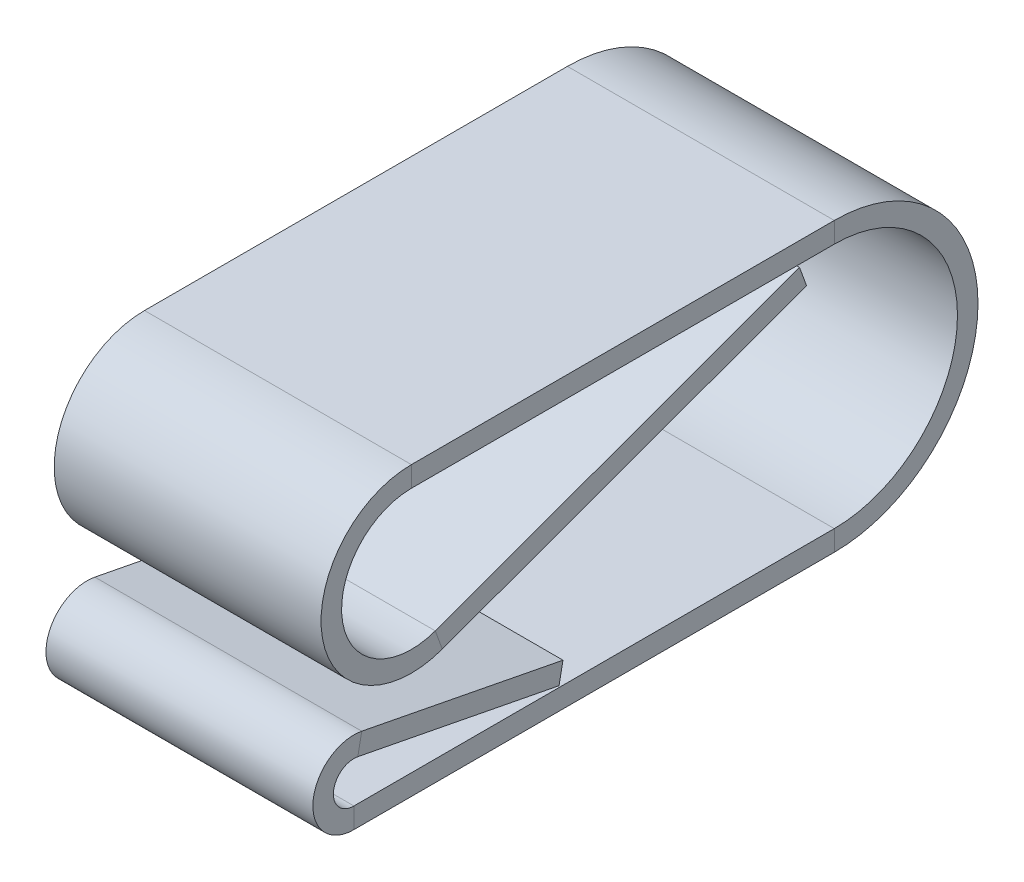
ISO-10303-21;
HEADER;
FILE_DESCRIPTION(('STEP AP214'),'2;1');
FILE_NAME('part.step','',(''),(''),'','','');
FILE_SCHEMA(('AUTOMOTIVE_DESIGN { 1 0 10303 214 1 1 1 1 }'));
ENDSEC;
DATA;
#1=APPLICATION_CONTEXT('core data for automotive mechanical design processes');
#2=APPLICATION_PROTOCOL_DEFINITION('international standard','automotive_design',2000,#1);
#3=PRODUCT_CONTEXT('',#1,'mechanical');
#4=PRODUCT('Part','Part','',(#3));
#5=PRODUCT_RELATED_PRODUCT_CATEGORY('part','',(#4));
#6=PRODUCT_DEFINITION_FORMATION('','',#4);
#7=PRODUCT_DEFINITION_CONTEXT('part definition',#1,'design');
#8=PRODUCT_DEFINITION('design','',#6,#7);
#9=PRODUCT_DEFINITION_SHAPE('','',#8);
#10=(LENGTH_UNIT() NAMED_UNIT(*) SI_UNIT(.MILLI.,.METRE.));
#11=(NAMED_UNIT(*) PLANE_ANGLE_UNIT() SI_UNIT($,.RADIAN.));
#12=(NAMED_UNIT(*) SI_UNIT($,.STERADIAN.) SOLID_ANGLE_UNIT());
#13=UNCERTAINTY_MEASURE_WITH_UNIT(LENGTH_MEASURE(1.E-05),#10,'distance_accuracy_value','');
#14=(GEOMETRIC_REPRESENTATION_CONTEXT(3) GLOBAL_UNCERTAINTY_ASSIGNED_CONTEXT((#13)) GLOBAL_UNIT_ASSIGNED_CONTEXT((#10,
#11,#12)) REPRESENTATION_CONTEXT('',''));
#15=CARTESIAN_POINT('',(0.,0.,0.));
#16=DIRECTION('',(0.,0.,1.));
#17=DIRECTION('',(1.,0.,0.));
#18=AXIS2_PLACEMENT_3D('',#15,#16,#17);
#19=CARTESIAN_POINT('',(0.,6.5,-6.45));
#20=DIRECTION('',(1.,0.,0.));
#21=DIRECTION('',(0.,0.,-1.));
#22=AXIS2_PLACEMENT_3D('',#19,#20,#21);
#23=PLANE('',#22);
#24=DIRECTION('',(0.,0.,1.));
#25=VECTOR('',#24,1.);
#26=CARTESIAN_POINT('',(0.,6.,-6.45));
#27=LINE('',#26,#25);
#28=CARTESIAN_POINT('',(0.,6.,-2.4));
#29=VERTEX_POINT('',#28);
#30=CARTESIAN_POINT('',(0.,6.,-12.7));
#31=VERTEX_POINT('',#30);
#32=EDGE_CURVE('E198',#29,#31,#27,.F.);
#33=ORIENTED_EDGE('',*,*,#32,.F.);
#34=DIRECTION('',(0.,1.,0.));
#35=VECTOR('',#34,1.);
#36=CARTESIAN_POINT('',(0.,6.,-2.4));
#37=LINE('',#36,#35);
#38=CARTESIAN_POINT('',(0.,6.5,-2.4));
#39=VERTEX_POINT('',#38);
#40=EDGE_CURVE('E173',#29,#39,#37,.T.);
#41=ORIENTED_EDGE('',*,*,#40,.T.);
#42=DIRECTION('',(0.,0.,-1.));
#43=VECTOR('',#42,1.);
#44=CARTESIAN_POINT('',(0.,6.5,-6.45));
#45=LINE('',#44,#43);
#46=CARTESIAN_POINT('',(0.,6.5,-12.7));
#47=VERTEX_POINT('',#46);
#48=EDGE_CURVE('E190',#39,#47,#45,.T.);
#49=ORIENTED_EDGE('',*,*,#48,.T.);
#50=DIRECTION('',(0.,1.,0.));
#51=VECTOR('',#50,1.);
#52=CARTESIAN_POINT('',(0.,6.5,-12.7));
#53=LINE('',#52,#51);
#54=EDGE_CURVE('E209',#31,#47,#53,.T.);
#55=ORIENTED_EDGE('',*,*,#54,.F.);
#56=EDGE_LOOP('',(#33,#41,#49,#55));
#57=FACE_BOUND('',#56,.T.);
#58=ADVANCED_FACE('F43',(#57),#23,.F.);
#59=CARTESIAN_POINT('',(0.,-0.5,0.));
#60=DIRECTION('',(-1.,0.,0.));
#61=DIRECTION('',(0.,0.,1.));
#62=AXIS2_PLACEMENT_3D('',#59,#60,#61);
#63=PLANE('',#62);
#64=DIRECTION('',(0.,0.,1.));
#65=VECTOR('',#64,1.);
#66=CARTESIAN_POINT('',(0.,0.,0.));
#67=LINE('',#66,#65);
#68=CARTESIAN_POINT('',(0.,0.,-12.7));
#69=VERTEX_POINT('',#68);
#70=CARTESIAN_POINT('',(0.,0.,-1.));
#71=VERTEX_POINT('',#70);
#72=EDGE_CURVE('E268',#69,#71,#67,.T.);
#73=ORIENTED_EDGE('',*,*,#72,.F.);
#74=DIRECTION('',(0.,-1.,0.));
#75=VECTOR('',#74,1.);
#76=CARTESIAN_POINT('',(0.,0.,-12.7));
#77=LINE('',#76,#75);
#78=CARTESIAN_POINT('',(0.,-0.5,-12.7));
#79=VERTEX_POINT('',#78);
#80=EDGE_CURVE('E287',#69,#79,#77,.T.);
#81=ORIENTED_EDGE('',*,*,#80,.T.);
#82=DIRECTION('',(0.,0.,1.));
#83=VECTOR('',#82,1.);
#84=CARTESIAN_POINT('',(0.,-0.5,0.));
#85=LINE('',#84,#83);
#86=CARTESIAN_POINT('',(0.,-0.499999999999992,-0.999999999999999));
#87=VERTEX_POINT('',#86);
#88=EDGE_CURVE('E52',#79,#87,#85,.T.);
#89=ORIENTED_EDGE('',*,*,#88,.T.);
#90=DIRECTION('',(0.,-1.,0.));
#91=VECTOR('',#90,1.);
#92=CARTESIAN_POINT('',(0.,0.,-1.));
#93=LINE('',#92,#91);
#94=EDGE_CURVE('E231',#71,#87,#93,.T.);
#95=ORIENTED_EDGE('',*,*,#94,.F.);
#96=EDGE_LOOP('',(#73,#81,#89,#95));
#97=FACE_BOUND('',#96,.T.);
#98=ADVANCED_FACE('F45',(#97),#63,.T.);
#99=CARTESIAN_POINT('',(6.5,-0.5,0.));
#100=DIRECTION('',(1.,0.,0.));
#101=DIRECTION('',(0.,0.,-1.));
#102=AXIS2_PLACEMENT_3D('',#99,#100,#101);
#103=PLANE('',#102);
#104=DIRECTION('',(0.,-1.,0.));
#105=VECTOR('',#104,1.);
#106=CARTESIAN_POINT('',(6.5,0.,-12.7));
#107=LINE('',#106,#105);
#108=CARTESIAN_POINT('',(6.5,0.,-12.7));
#109=VERTEX_POINT('',#108);
#110=CARTESIAN_POINT('',(6.5,-0.5,-12.7));
#111=VERTEX_POINT('',#110);
#112=EDGE_CURVE('E208',#109,#111,#107,.T.);
#113=ORIENTED_EDGE('',*,*,#112,.F.);
#114=DIRECTION('',(0.,0.,-1.));
#115=VECTOR('',#114,1.);
#116=CARTESIAN_POINT('',(6.5,0.,0.));
#117=LINE('',#116,#115);
#118=CARTESIAN_POINT('',(6.5,0.,-1.));
#119=VERTEX_POINT('',#118);
#120=EDGE_CURVE('E47',#119,#109,#117,.T.);
#121=ORIENTED_EDGE('',*,*,#120,.F.);
#122=DIRECTION('',(0.,-1.,0.));
#123=VECTOR('',#122,1.);
#124=CARTESIAN_POINT('',(6.5,0.,-1.));
#125=LINE('',#124,#123);
#126=CARTESIAN_POINT('',(6.5,-0.499999999999992,-0.999999999999999));
#127=VERTEX_POINT('',#126);
#128=EDGE_CURVE('E221',#119,#127,#125,.T.);
#129=ORIENTED_EDGE('',*,*,#128,.T.);
#130=DIRECTION('',(0.,0.,-1.));
#131=VECTOR('',#130,1.);
#132=CARTESIAN_POINT('',(6.5,-0.5,0.));
#133=LINE('',#132,#131);
#134=EDGE_CURVE('E11',#127,#111,#133,.T.);
#135=ORIENTED_EDGE('',*,*,#134,.T.);
#136=EDGE_LOOP('',(#113,#121,#129,#135));
#137=FACE_BOUND('',#136,.T.);
#138=ADVANCED_FACE('F280',(#137),#103,.T.);
#139=CARTESIAN_POINT('',(0.,-0.5,0.));
#140=DIRECTION('',(0.,-1.,0.));
#141=DIRECTION('',(0.,0.,-1.));
#142=AXIS2_PLACEMENT_3D('',#139,#140,#141);
#143=PLANE('',#142);
#144=DIRECTION('',(-1.,0.,0.));
#145=VECTOR('',#144,1.);
#146=CARTESIAN_POINT('',(0.,-0.5,-12.7));
#147=LINE('',#146,#145);
#148=EDGE_CURVE('E306',#79,#111,#147,.F.);
#149=ORIENTED_EDGE('',*,*,#148,.T.);
#150=ORIENTED_EDGE('',*,*,#134,.F.);
#151=DIRECTION('',(1.,0.,0.));
#152=VECTOR('',#151,1.);
#153=CARTESIAN_POINT('',(6.5,-0.499999999999992,-0.999999999999999));
#154=LINE('',#153,#152);
#155=EDGE_CURVE('E214',#127,#87,#154,.F.);
#156=ORIENTED_EDGE('',*,*,#155,.T.);
#157=ORIENTED_EDGE('',*,*,#88,.F.);
#158=EDGE_LOOP('',(#149,#150,#156,#157));
#159=FACE_BOUND('',#158,.T.);
#160=ADVANCED_FACE('F425',(#159),#143,.T.);
#161=CARTESIAN_POINT('',(0.,0.,0.));
#162=DIRECTION('',(0.,-1.,0.));
#163=DIRECTION('',(0.,0.,-1.));
#164=AXIS2_PLACEMENT_3D('',#161,#162,#163);
#165=PLANE('',#164);
#166=ORIENTED_EDGE('',*,*,#120,.T.);
#167=DIRECTION('',(-1.,0.,0.));
#168=VECTOR('',#167,1.);
#169=CARTESIAN_POINT('',(0.,0.,-12.7));
#170=LINE('',#169,#168);
#171=EDGE_CURVE('E277',#69,#109,#170,.F.);
#172=ORIENTED_EDGE('',*,*,#171,.F.);
#173=ORIENTED_EDGE('',*,*,#72,.T.);
#174=DIRECTION('',(1.,0.,0.));
#175=VECTOR('',#174,1.);
#176=CARTESIAN_POINT('',(6.5,0.,-1.));
#177=LINE('',#176,#175);
#178=EDGE_CURVE('E227',#119,#71,#177,.F.);
#179=ORIENTED_EDGE('',*,*,#178,.F.);
#180=EDGE_LOOP('',(#166,#172,#173,#179));
#181=FACE_BOUND('',#180,.T.);
#182=ADVANCED_FACE('F276',(#181),#165,.F.);
#183=CARTESIAN_POINT('',(6.5,1.00530128712337,-3.64129329822227));
#184=DIRECTION('',(-1.,0.,0.));
#185=DIRECTION('',(0.,0.190808995376552,0.981627183447662));
#186=AXIS2_PLACEMENT_3D('',#183,#184,#185);
#187=PLANE('',#186);
#188=DIRECTION('',(0.,0.981627183447662,-0.190808995376552));
#189=VECTOR('',#188,1.);
#190=CARTESIAN_POINT('',(6.5,1.48162718344766,-1.19080899537655));
#191=LINE('',#190,#189);
#192=CARTESIAN_POINT('',(6.5,0.990813591723831,-1.09540449768828));
#193=VERTEX_POINT('',#192);
#194=CARTESIAN_POINT('',(6.5,1.48162718344766,-1.19080899537655));
#195=VERTEX_POINT('',#194);
#196=EDGE_CURVE('E262',#193,#195,#191,.T.);
#197=ORIENTED_EDGE('',*,*,#196,.F.);
#198=DIRECTION('',(0.,0.190808995376552,0.981627183447663));
#199=VECTOR('',#198,1.);
#200=CARTESIAN_POINT('',(6.5,0.514487695399534,-3.545888800534));
#201=LINE('',#200,#199);
#202=CARTESIAN_POINT('',(6.5,0.0381617990752364,-5.99637310337972));
#203=VERTEX_POINT('',#202);
#204=EDGE_CURVE('E253',#203,#193,#201,.T.);
#205=ORIENTED_EDGE('',*,*,#204,.F.);
#206=DIRECTION('',(0.,0.981627183447662,-0.190808995376552));
#207=VECTOR('',#206,1.);
#208=CARTESIAN_POINT('',(6.5,0.528975390799068,-6.09177760106799));
#209=LINE('',#208,#207);
#210=CARTESIAN_POINT('',(6.5,0.528975390799068,-6.09177760106799));
#211=VERTEX_POINT('',#210);
#212=EDGE_CURVE('E260',#203,#211,#209,.T.);
#213=ORIENTED_EDGE('',*,*,#212,.T.);
#214=DIRECTION('',(0.,0.190808995376552,0.981627183447662));
#215=VECTOR('',#214,1.);
#216=CARTESIAN_POINT('',(6.5,1.00530128712337,-3.64129329822227));
#217=LINE('',#216,#215);
#218=EDGE_CURVE('E241',#211,#195,#217,.T.);
#219=ORIENTED_EDGE('',*,*,#218,.T.);
#220=EDGE_LOOP('',(#197,#205,#213,#219));
#221=FACE_BOUND('',#220,.T.);
#222=ADVANCED_FACE('F417',(#221),#187,.F.);
#223=CARTESIAN_POINT('',(3.25,0.528975390799068,-6.09177760106799));
#224=DIRECTION('',(0.,0.190808995376552,0.981627183447663));
#225=DIRECTION('',(1.,0.,0.));
#226=AXIS2_PLACEMENT_3D('',#223,#224,#225);
#227=PLANE('',#226);
#228=ORIENTED_EDGE('',*,*,#212,.F.);
#229=DIRECTION('',(1.,0.,0.));
#230=VECTOR('',#229,1.);
#231=CARTESIAN_POINT('',(3.25,0.0381617990752364,-5.99637310337972));
#232=LINE('',#231,#230);
#233=CARTESIAN_POINT('',(0.,0.0381617990752364,-5.99637310337972));
#234=VERTEX_POINT('',#233);
#235=EDGE_CURVE('E250',#234,#203,#232,.T.);
#236=ORIENTED_EDGE('',*,*,#235,.F.);
#237=DIRECTION('',(0.,0.981627183447662,-0.190808995376552));
#238=VECTOR('',#237,1.);
#239=CARTESIAN_POINT('',(0.,0.528975390799068,-6.09177760106799));
#240=LINE('',#239,#238);
#241=CARTESIAN_POINT('',(0.,0.528975390799068,-6.09177760106799));
#242=VERTEX_POINT('',#241);
#243=EDGE_CURVE('E240',#234,#242,#240,.T.);
#244=ORIENTED_EDGE('',*,*,#243,.T.);
#245=DIRECTION('',(1.,0.,0.));
#246=VECTOR('',#245,1.);
#247=CARTESIAN_POINT('',(3.25,0.528975390799068,-6.09177760106799));
#248=LINE('',#247,#246);
#249=EDGE_CURVE('E237',#242,#211,#248,.T.);
#250=ORIENTED_EDGE('',*,*,#249,.T.);
#251=EDGE_LOOP('',(#228,#236,#244,#250));
#252=FACE_BOUND('',#251,.T.);
#253=ADVANCED_FACE('F414',(#252),#227,.F.);
#254=CARTESIAN_POINT('',(0.,1.00530128712337,-3.64129329822227));
#255=DIRECTION('',(1.,0.,0.));
#256=DIRECTION('',(0.,-0.190808995376552,-0.981627183447662));
#257=AXIS2_PLACEMENT_3D('',#254,#255,#256);
#258=PLANE('',#257);
#259=DIRECTION('',(0.,0.190808995376552,0.981627183447663));
#260=VECTOR('',#259,1.);
#261=CARTESIAN_POINT('',(0.,0.514487695399534,-3.545888800534));
#262=LINE('',#261,#260);
#263=CARTESIAN_POINT('',(0.,0.990813591723831,-1.09540449768828));
#264=VERTEX_POINT('',#263);
#265=EDGE_CURVE('E234',#264,#234,#262,.F.);
#266=ORIENTED_EDGE('',*,*,#265,.F.);
#267=DIRECTION('',(0.,0.981627183447662,-0.190808995376552));
#268=VECTOR('',#267,1.);
#269=CARTESIAN_POINT('',(0.,1.48162718344766,-1.19080899537655));
#270=LINE('',#269,#268);
#271=CARTESIAN_POINT('',(0.,1.48162718344766,-1.19080899537655));
#272=VERTEX_POINT('',#271);
#273=EDGE_CURVE('E265',#264,#272,#270,.T.);
#274=ORIENTED_EDGE('',*,*,#273,.T.);
#275=DIRECTION('',(0.,-0.190808995376552,-0.981627183447662));
#276=VECTOR('',#275,1.);
#277=CARTESIAN_POINT('',(0.,1.00530128712337,-3.64129329822227));
#278=LINE('',#277,#276);
#279=EDGE_CURVE('E247',#272,#242,#278,.T.);
#280=ORIENTED_EDGE('',*,*,#279,.T.);
#281=ORIENTED_EDGE('',*,*,#243,.F.);
#282=EDGE_LOOP('',(#266,#274,#280,#281));
#283=FACE_BOUND('',#282,.T.);
#284=ADVANCED_FACE('F409',(#283),#258,.F.);
#285=CARTESIAN_POINT('',(3.25,1.00530128712337,-3.64129329822227));
#286=DIRECTION('',(0.,0.981627183447662,-0.190808995376552));
#287=DIRECTION('',(0.,0.190808995376552,0.981627183447663));
#288=AXIS2_PLACEMENT_3D('',#285,#286,#287);
#289=PLANE('',#288);
#290=ORIENTED_EDGE('',*,*,#249,.F.);
#291=ORIENTED_EDGE('',*,*,#279,.F.);
#292=DIRECTION('',(-1.,0.,0.));
#293=VECTOR('',#292,1.);
#294=CARTESIAN_POINT('',(3.25,1.48162718344766,-1.19080899537655));
#295=LINE('',#294,#293);
#296=EDGE_CURVE('E244',#195,#272,#295,.T.);
#297=ORIENTED_EDGE('',*,*,#296,.F.);
#298=ORIENTED_EDGE('',*,*,#218,.F.);
#299=EDGE_LOOP('',(#290,#291,#297,#298));
#300=FACE_BOUND('',#299,.T.);
#301=ADVANCED_FACE('F406',(#300),#289,.T.);
#302=CARTESIAN_POINT('',(3.25,0.514487695399534,-3.545888800534));
#303=DIRECTION('',(0.,0.981627183447662,-0.190808995376552));
#304=DIRECTION('',(0.,0.190808995376552,0.981627183447663));
#305=AXIS2_PLACEMENT_3D('',#302,#303,#304);
#306=PLANE('',#305);
#307=ORIENTED_EDGE('',*,*,#235,.T.);
#308=ORIENTED_EDGE('',*,*,#204,.T.);
#309=DIRECTION('',(1.,0.,0.));
#310=VECTOR('',#309,1.);
#311=CARTESIAN_POINT('',(3.25,0.990813591723831,-1.09540449768828));
#312=LINE('',#311,#310);
#313=EDGE_CURVE('E256',#193,#264,#312,.F.);
#314=ORIENTED_EDGE('',*,*,#313,.T.);
#315=ORIENTED_EDGE('',*,*,#265,.T.);
#316=EDGE_LOOP('',(#307,#308,#314,#315));
#317=FACE_BOUND('',#316,.T.);
#318=ADVANCED_FACE('F401',(#317),#306,.F.);
#319=CARTESIAN_POINT('',(0.,0.500000000000004,-1.));
#320=DIRECTION('',(-1.,0.,0.));
#321=DIRECTION('',(0.,0.,1.));
#322=AXIS2_PLACEMENT_3D('',#319,#320,#321);
#323=PLANE('',#322);
#324=ORIENTED_EDGE('',*,*,#273,.F.);
#325=CARTESIAN_POINT('',(0.,0.500000000000004,-1.));
#326=DIRECTION('',(1.,0.,0.));
#327=DIRECTION('',(0.,0.,-1.));
#328=AXIS2_PLACEMENT_3D('',#325,#326,#327);
#329=CIRCLE('',#328,0.499999999999996);
#330=EDGE_CURVE('E224',#71,#264,#329,.F.);
#331=ORIENTED_EDGE('',*,*,#330,.F.);
#332=ORIENTED_EDGE('',*,*,#94,.T.);
#333=CARTESIAN_POINT('',(0.,0.500000000000004,-1.));
#334=DIRECTION('',(1.,0.,0.));
#335=DIRECTION('',(0.,0.,-1.));
#336=AXIS2_PLACEMENT_3D('',#333,#334,#335);
#337=CIRCLE('',#336,0.999999999999996);
#338=EDGE_CURVE('E217',#87,#272,#337,.F.);
#339=ORIENTED_EDGE('',*,*,#338,.T.);
#340=EDGE_LOOP('',(#324,#331,#332,#339));
#341=FACE_BOUND('',#340,.T.);
#342=ADVANCED_FACE('F398',(#341),#323,.T.);
#343=CARTESIAN_POINT('',(6.5,0.500000000000004,-1.));
#344=DIRECTION('',(-1.,0.,0.));
#345=DIRECTION('',(0.,0.,1.));
#346=AXIS2_PLACEMENT_3D('',#343,#344,#345);
#347=PLANE('',#346);
#348=CARTESIAN_POINT('',(6.5,0.500000000000004,-1.));
#349=DIRECTION('',(1.,0.,0.));
#350=DIRECTION('',(0.,0.,-1.));
#351=AXIS2_PLACEMENT_3D('',#348,#349,#350);
#352=CIRCLE('',#351,0.499999999999996);
#353=EDGE_CURVE('E213',#193,#119,#352,.T.);
#354=ORIENTED_EDGE('',*,*,#353,.F.);
#355=ORIENTED_EDGE('',*,*,#196,.T.);
#356=CARTESIAN_POINT('',(6.5,0.500000000000004,-1.));
#357=DIRECTION('',(1.,0.,0.));
#358=DIRECTION('',(0.,0.,-1.));
#359=AXIS2_PLACEMENT_3D('',#356,#357,#358);
#360=CIRCLE('',#359,0.999999999999996);
#361=EDGE_CURVE('E218',#195,#127,#360,.T.);
#362=ORIENTED_EDGE('',*,*,#361,.T.);
#363=ORIENTED_EDGE('',*,*,#128,.F.);
#364=EDGE_LOOP('',(#354,#355,#362,#363));
#365=FACE_BOUND('',#364,.T.);
#366=ADVANCED_FACE('F393',(#365),#347,.F.);
#367=CARTESIAN_POINT('',(6.5,0.500000000000004,-1.));
#368=DIRECTION('',(1.,0.,0.));
#369=DIRECTION('',(0.,0.981627183447662,-0.190808995376552));
#370=AXIS2_PLACEMENT_3D('',#367,#368,#369);
#371=CYLINDRICAL_SURFACE('',#370,0.999999999999996);
#372=ORIENTED_EDGE('',*,*,#155,.F.);
#373=ORIENTED_EDGE('',*,*,#361,.F.);
#374=ORIENTED_EDGE('',*,*,#296,.T.);
#375=ORIENTED_EDGE('',*,*,#338,.F.);
#376=EDGE_LOOP('',(#372,#373,#374,#375));
#377=FACE_BOUND('',#376,.T.);
#378=ADVANCED_FACE('F390',(#377),#371,.T.);
#379=CARTESIAN_POINT('',(6.5,0.500000000000004,-1.));
#380=DIRECTION('',(1.,0.,0.));
#381=DIRECTION('',(0.,0.981627183447662,-0.190808995376552));
#382=AXIS2_PLACEMENT_3D('',#379,#380,#381);
#383=CYLINDRICAL_SURFACE('',#382,0.499999999999996);
#384=ORIENTED_EDGE('',*,*,#178,.T.);
#385=ORIENTED_EDGE('',*,*,#330,.T.);
#386=ORIENTED_EDGE('',*,*,#313,.F.);
#387=ORIENTED_EDGE('',*,*,#353,.T.);
#388=EDGE_LOOP('',(#384,#385,#386,#387));
#389=FACE_BOUND('',#388,.T.);
#390=ADVANCED_FACE('F389',(#389),#383,.F.);
#391=CARTESIAN_POINT('',(6.5,6.5,-6.45));
#392=DIRECTION('',(-1.,0.,0.));
#393=DIRECTION('',(0.,0.,1.));
#394=AXIS2_PLACEMENT_3D('',#391,#392,#393);
#395=PLANE('',#394);
#396=DIRECTION('',(0.,1.,0.));
#397=VECTOR('',#396,1.);
#398=CARTESIAN_POINT('',(6.5,6.,-2.4));
#399=LINE('',#398,#397);
#400=CARTESIAN_POINT('',(6.5,6.,-2.4));
#401=VERTEX_POINT('',#400);
#402=CARTESIAN_POINT('',(6.5,6.5,-2.4));
#403=VERTEX_POINT('',#402);
#404=EDGE_CURVE('E161',#401,#403,#399,.T.);
#405=ORIENTED_EDGE('',*,*,#404,.F.);
#406=DIRECTION('',(0.,0.,1.));
#407=VECTOR('',#406,1.);
#408=CARTESIAN_POINT('',(6.5,6.,-6.45));
#409=LINE('',#408,#407);
#410=CARTESIAN_POINT('',(6.5,6.,-12.7));
#411=VERTEX_POINT('',#410);
#412=EDGE_CURVE('E206',#411,#401,#409,.T.);
#413=ORIENTED_EDGE('',*,*,#412,.F.);
#414=DIRECTION('',(0.,1.,0.));
#415=VECTOR('',#414,1.);
#416=CARTESIAN_POINT('',(6.5,6.5,-12.7));
#417=LINE('',#416,#415);
#418=CARTESIAN_POINT('',(6.5,6.5,-12.7));
#419=VERTEX_POINT('',#418);
#420=EDGE_CURVE('E195',#411,#419,#417,.T.);
#421=ORIENTED_EDGE('',*,*,#420,.T.);
#422=DIRECTION('',(0.,0.,1.));
#423=VECTOR('',#422,1.);
#424=CARTESIAN_POINT('',(6.5,6.5,-6.45));
#425=LINE('',#424,#423);
#426=EDGE_CURVE('E188',#419,#403,#425,.T.);
#427=ORIENTED_EDGE('',*,*,#426,.T.);
#428=EDGE_LOOP('',(#405,#413,#421,#427));
#429=FACE_BOUND('',#428,.T.);
#430=ADVANCED_FACE('F193',(#429),#395,.F.);
#431=CARTESIAN_POINT('',(3.25,6.5,-6.45));
#432=DIRECTION('',(0.,1.,0.));
#433=DIRECTION('',(0.,0.,1.));
#434=AXIS2_PLACEMENT_3D('',#431,#432,#433);
#435=PLANE('',#434);
#436=DIRECTION('',(-1.,0.,0.));
#437=VECTOR('',#436,1.);
#438=CARTESIAN_POINT('',(0.,6.5,-2.4));
#439=LINE('',#438,#437);
#440=EDGE_CURVE('E180',#39,#403,#439,.F.);
#441=ORIENTED_EDGE('',*,*,#440,.T.);
#442=ORIENTED_EDGE('',*,*,#426,.F.);
#443=DIRECTION('',(1.,0.,0.));
#444=VECTOR('',#443,1.);
#445=CARTESIAN_POINT('',(3.25,6.5,-12.7));
#446=LINE('',#445,#444);
#447=EDGE_CURVE('E197',#47,#419,#446,.T.);
#448=ORIENTED_EDGE('',*,*,#447,.F.);
#449=ORIENTED_EDGE('',*,*,#48,.F.);
#450=EDGE_LOOP('',(#441,#442,#448,#449));
#451=FACE_BOUND('',#450,.T.);
#452=ADVANCED_FACE('F186',(#451),#435,.T.);
#453=CARTESIAN_POINT('',(3.25,6.,-6.45));
#454=DIRECTION('',(0.,1.,0.));
#455=DIRECTION('',(0.,0.,1.));
#456=AXIS2_PLACEMENT_3D('',#453,#454,#455);
#457=PLANE('',#456);
#458=ORIENTED_EDGE('',*,*,#412,.T.);
#459=DIRECTION('',(-1.,0.,0.));
#460=VECTOR('',#459,1.);
#461=CARTESIAN_POINT('',(0.,6.,-2.4));
#462=LINE('',#461,#460);
#463=EDGE_CURVE('E360',#29,#401,#462,.F.);
#464=ORIENTED_EDGE('',*,*,#463,.F.);
#465=ORIENTED_EDGE('',*,*,#32,.T.);
#466=DIRECTION('',(1.,0.,0.));
#467=VECTOR('',#466,1.);
#468=CARTESIAN_POINT('',(3.25,6.,-12.7));
#469=LINE('',#468,#467);
#470=EDGE_CURVE('E201',#31,#411,#469,.T.);
#471=ORIENTED_EDGE('',*,*,#470,.T.);
#472=EDGE_LOOP('',(#458,#464,#465,#471));
#473=FACE_BOUND('',#472,.T.);
#474=ADVANCED_FACE('F366',(#473),#457,.F.);
#475=CARTESIAN_POINT('',(6.5,3.,-12.7));
#476=DIRECTION('',(1.,0.,0.));
#477=DIRECTION('',(0.,0.,-1.));
#478=AXIS2_PLACEMENT_3D('',#475,#476,#477);
#479=PLANE('',#478);
#480=ORIENTED_EDGE('',*,*,#420,.F.);
#481=CARTESIAN_POINT('',(6.5,3.,-12.7));
#482=DIRECTION('',(-1.,0.,0.));
#483=DIRECTION('',(0.,0.,1.));
#484=AXIS2_PLACEMENT_3D('',#481,#482,#483);
#485=CIRCLE('',#484,3.);
#486=EDGE_CURVE('E307',#109,#411,#485,.F.);
#487=ORIENTED_EDGE('',*,*,#486,.F.);
#488=ORIENTED_EDGE('',*,*,#112,.T.);
#489=CARTESIAN_POINT('',(6.5,3.,-12.7));
#490=DIRECTION('',(-1.,0.,0.));
#491=DIRECTION('',(0.,0.,1.));
#492=AXIS2_PLACEMENT_3D('',#489,#490,#491);
#493=CIRCLE('',#492,3.5);
#494=EDGE_CURVE('E290',#111,#419,#493,.F.);
#495=ORIENTED_EDGE('',*,*,#494,.T.);
#496=EDGE_LOOP('',(#480,#487,#488,#495));
#497=FACE_BOUND('',#496,.T.);
#498=ADVANCED_FACE('F367',(#497),#479,.T.);
#499=CARTESIAN_POINT('',(0.,3.,-12.7));
#500=DIRECTION('',(1.,0.,0.));
#501=DIRECTION('',(0.,0.,-1.));
#502=AXIS2_PLACEMENT_3D('',#499,#500,#501);
#503=PLANE('',#502);
#504=CARTESIAN_POINT('',(0.,3.,-12.7));
#505=DIRECTION('',(-1.,0.,0.));
#506=DIRECTION('',(0.,0.,1.));
#507=AXIS2_PLACEMENT_3D('',#504,#505,#506);
#508=CIRCLE('',#507,3.);
#509=EDGE_CURVE('E68',#31,#69,#508,.T.);
#510=ORIENTED_EDGE('',*,*,#509,.F.);
#511=ORIENTED_EDGE('',*,*,#54,.T.);
#512=CARTESIAN_POINT('',(0.,3.,-12.7));
#513=DIRECTION('',(-1.,0.,0.));
#514=DIRECTION('',(0.,0.,1.));
#515=AXIS2_PLACEMENT_3D('',#512,#513,#514);
#516=CIRCLE('',#515,3.5);
#517=EDGE_CURVE('E303',#47,#79,#516,.T.);
#518=ORIENTED_EDGE('',*,*,#517,.T.);
#519=ORIENTED_EDGE('',*,*,#80,.F.);
#520=EDGE_LOOP('',(#510,#511,#518,#519));
#521=FACE_BOUND('',#520,.T.);
#522=ADVANCED_FACE('F302',(#521),#503,.F.);
#523=CARTESIAN_POINT('',(0.,3.,-12.7));
#524=DIRECTION('',(-1.,0.,0.));
#525=DIRECTION('',(0.,1.,0.));
#526=AXIS2_PLACEMENT_3D('',#523,#524,#525);
#527=CYLINDRICAL_SURFACE('',#526,3.5);
#528=ORIENTED_EDGE('',*,*,#148,.F.);
#529=ORIENTED_EDGE('',*,*,#517,.F.);
#530=ORIENTED_EDGE('',*,*,#447,.T.);
#531=ORIENTED_EDGE('',*,*,#494,.F.);
#532=EDGE_LOOP('',(#528,#529,#530,#531));
#533=FACE_BOUND('',#532,.T.);
#534=ADVANCED_FACE('F304',(#533),#527,.T.);
#535=CARTESIAN_POINT('',(0.,3.,-12.7));
#536=DIRECTION('',(-1.,0.,0.));
#537=DIRECTION('',(0.,1.,0.));
#538=AXIS2_PLACEMENT_3D('',#535,#536,#537);
#539=CYLINDRICAL_SURFACE('',#538,3.);
#540=ORIENTED_EDGE('',*,*,#171,.T.);
#541=ORIENTED_EDGE('',*,*,#486,.T.);
#542=ORIENTED_EDGE('',*,*,#470,.F.);
#543=ORIENTED_EDGE('',*,*,#509,.T.);
#544=EDGE_LOOP('',(#540,#541,#542,#543));
#545=FACE_BOUND('',#544,.T.);
#546=ADVANCED_FACE('F368',(#545),#539,.F.);
#547=CARTESIAN_POINT('',(0.,3.84721294760653,-7.5883474780862));
#548=DIRECTION('',(1.,0.,0.));
#549=DIRECTION('',(0.,-0.342020143325676,0.939692620785906));
#550=AXIS2_PLACEMENT_3D('',#547,#548,#549);
#551=PLANE('',#550);
#552=DIRECTION('',(0.,-0.939692620785906,-0.342020143325676));
#553=VECTOR('',#552,1.);
#554=CARTESIAN_POINT('',(0.,2.23267623427101,-3.15244431531649));
#555=LINE('',#554,#553);
#556=CARTESIAN_POINT('',(0.,2.70252254466396,-2.98143424365365));
#557=VERTEX_POINT('',#556);
#558=CARTESIAN_POINT('',(0.,2.23267623427101,-3.15244431531649));
#559=VERTEX_POINT('',#558);
#560=EDGE_CURVE('E315',#557,#559,#555,.T.);
#561=ORIENTED_EDGE('',*,*,#560,.F.);
#562=DIRECTION('',(0.,0.342020143325676,-0.939692620785906));
#563=VECTOR('',#562,1.);
#564=CARTESIAN_POINT('',(0.,4.31705925799948,-7.41733740642336));
#565=LINE('',#564,#563);
#566=CARTESIAN_POINT('',(0.,5.931595971335,-11.8532405691931));
#567=VERTEX_POINT('',#566);
#568=EDGE_CURVE('E343',#567,#557,#565,.F.);
#569=ORIENTED_EDGE('',*,*,#568,.F.);
#570=DIRECTION('',(0.,-0.939692620785906,-0.342020143325676));
#571=VECTOR('',#570,1.);
#572=CARTESIAN_POINT('',(0.,5.46174966094204,-12.0242506408559));
#573=LINE('',#572,#571);
#574=CARTESIAN_POINT('',(0.,5.46174966094204,-12.0242506408559));
#575=VERTEX_POINT('',#574);
#576=EDGE_CURVE('E321',#567,#575,#573,.T.);
#577=ORIENTED_EDGE('',*,*,#576,.T.);
#578=DIRECTION('',(0.,-0.342020143325676,0.939692620785906));
#579=VECTOR('',#578,1.);
#580=CARTESIAN_POINT('',(0.,3.84721294760653,-7.5883474780862));
#581=LINE('',#580,#579);
#582=EDGE_CURVE('E330',#575,#559,#581,.T.);
#583=ORIENTED_EDGE('',*,*,#582,.T.);
#584=EDGE_LOOP('',(#561,#569,#577,#583));
#585=FACE_BOUND('',#584,.T.);
#586=ADVANCED_FACE('F355',(#585),#551,.F.);
#587=CARTESIAN_POINT('',(3.25,5.46174966094204,-12.0242506408559));
#588=DIRECTION('',(0.,-0.342020143325676,0.939692620785906));
#589=DIRECTION('',(-1.,0.,0.));
#590=AXIS2_PLACEMENT_3D('',#587,#588,#589);
#591=PLANE('',#590);
#592=ORIENTED_EDGE('',*,*,#576,.F.);
#593=DIRECTION('',(1.,0.,0.));
#594=VECTOR('',#593,1.);
#595=CARTESIAN_POINT('',(3.25,5.931595971335,-11.8532405691931));
#596=LINE('',#595,#594);
#597=CARTESIAN_POINT('',(6.5,5.931595971335,-11.8532405691931));
#598=VERTEX_POINT('',#597);
#599=EDGE_CURVE('E340',#598,#567,#596,.F.);
#600=ORIENTED_EDGE('',*,*,#599,.F.);
#601=DIRECTION('',(0.,-0.939692620785906,-0.342020143325676));
#602=VECTOR('',#601,1.);
#603=CARTESIAN_POINT('',(6.5,5.46174966094204,-12.0242506408559));
#604=LINE('',#603,#602);
#605=CARTESIAN_POINT('',(6.5,5.46174966094204,-12.0242506408559));
#606=VERTEX_POINT('',#605);
#607=EDGE_CURVE('E325',#598,#606,#604,.T.);
#608=ORIENTED_EDGE('',*,*,#607,.T.);
#609=DIRECTION('',(-1.,0.,0.));
#610=VECTOR('',#609,1.);
#611=CARTESIAN_POINT('',(3.25,5.46174966094204,-12.0242506408559));
#612=LINE('',#611,#610);
#613=EDGE_CURVE('E326',#606,#575,#612,.T.);
#614=ORIENTED_EDGE('',*,*,#613,.T.);
#615=EDGE_LOOP('',(#592,#600,#608,#614));
#616=FACE_BOUND('',#615,.T.);
#617=ADVANCED_FACE('F351',(#616),#591,.F.);
#618=CARTESIAN_POINT('',(6.5,3.84721294760653,-7.5883474780862));
#619=DIRECTION('',(-1.,0.,0.));
#620=DIRECTION('',(0.,0.342020143325676,-0.939692620785906));
#621=AXIS2_PLACEMENT_3D('',#618,#619,#620);
#622=PLANE('',#621);
#623=DIRECTION('',(0.,0.342020143325676,-0.939692620785906));
#624=VECTOR('',#623,1.);
#625=CARTESIAN_POINT('',(6.5,4.31705925799948,-7.41733740642336));
#626=LINE('',#625,#624);
#627=CARTESIAN_POINT('',(6.5,2.70252254466396,-2.98143424365365));
#628=VERTEX_POINT('',#627);
#629=EDGE_CURVE('E172',#628,#598,#626,.T.);
#630=ORIENTED_EDGE('',*,*,#629,.F.);
#631=DIRECTION('',(0.,-0.939692620785906,-0.342020143325676));
#632=VECTOR('',#631,1.);
#633=CARTESIAN_POINT('',(6.5,2.23267623427101,-3.15244431531649));
#634=LINE('',#633,#632);
#635=CARTESIAN_POINT('',(6.5,2.23267623427101,-3.15244431531649));
#636=VERTEX_POINT('',#635);
#637=EDGE_CURVE('E313',#628,#636,#634,.T.);
#638=ORIENTED_EDGE('',*,*,#637,.T.);
#639=DIRECTION('',(0.,0.342020143325676,-0.939692620785906));
#640=VECTOR('',#639,1.);
#641=CARTESIAN_POINT('',(6.5,3.84721294760653,-7.5883474780862));
#642=LINE('',#641,#640);
#643=EDGE_CURVE('E338',#636,#606,#642,.T.);
#644=ORIENTED_EDGE('',*,*,#643,.T.);
#645=ORIENTED_EDGE('',*,*,#607,.F.);
#646=EDGE_LOOP('',(#630,#638,#644,#645));
#647=FACE_BOUND('',#646,.T.);
#648=ADVANCED_FACE('F538',(#647),#622,.F.);
#649=CARTESIAN_POINT('',(3.25,3.84721294760653,-7.5883474780862));
#650=DIRECTION('',(0.,-0.939692620785906,-0.342020143325676));
#651=DIRECTION('',(0.,0.342020143325676,-0.939692620785906));
#652=AXIS2_PLACEMENT_3D('',#649,#650,#651);
#653=PLANE('',#652);
#654=ORIENTED_EDGE('',*,*,#613,.F.);
#655=ORIENTED_EDGE('',*,*,#643,.F.);
#656=DIRECTION('',(1.,0.,0.));
#657=VECTOR('',#656,1.);
#658=CARTESIAN_POINT('',(3.25,2.23267623427101,-3.15244431531649));
#659=LINE('',#658,#657);
#660=EDGE_CURVE('E182',#559,#636,#659,.T.);
#661=ORIENTED_EDGE('',*,*,#660,.F.);
#662=ORIENTED_EDGE('',*,*,#582,.F.);
#663=EDGE_LOOP('',(#654,#655,#661,#662));
#664=FACE_BOUND('',#663,.T.);
#665=ADVANCED_FACE('F546',(#664),#653,.T.);
#666=CARTESIAN_POINT('',(3.25,4.31705925799948,-7.41733740642336));
#667=DIRECTION('',(0.,-0.939692620785906,-0.342020143325676));
#668=DIRECTION('',(0.,0.342020143325676,-0.939692620785906));
#669=AXIS2_PLACEMENT_3D('',#666,#667,#668);
#670=PLANE('',#669);
#671=ORIENTED_EDGE('',*,*,#599,.T.);
#672=ORIENTED_EDGE('',*,*,#568,.T.);
#673=DIRECTION('',(1.,0.,0.));
#674=VECTOR('',#673,1.);
#675=CARTESIAN_POINT('',(3.25,2.70252254466396,-2.98143424365365));
#676=LINE('',#675,#674);
#677=EDGE_CURVE('E346',#557,#628,#676,.T.);
#678=ORIENTED_EDGE('',*,*,#677,.T.);
#679=ORIENTED_EDGE('',*,*,#629,.T.);
#680=EDGE_LOOP('',(#671,#672,#678,#679));
#681=FACE_BOUND('',#680,.T.);
#682=ADVANCED_FACE('F350',(#681),#670,.F.);
#683=CARTESIAN_POINT('',(6.5,4.3,-2.4));
#684=DIRECTION('',(1.,0.,0.));
#685=DIRECTION('',(0.,0.,-1.));
#686=AXIS2_PLACEMENT_3D('',#683,#684,#685);
#687=PLANE('',#686);
#688=ORIENTED_EDGE('',*,*,#637,.F.);
#689=CARTESIAN_POINT('',(6.5,4.3,-2.4));
#690=DIRECTION('',(-1.,0.,0.));
#691=DIRECTION('',(0.,0.,1.));
#692=AXIS2_PLACEMENT_3D('',#689,#690,#691);
#693=CIRCLE('',#692,1.7);
#694=EDGE_CURVE('E167',#401,#628,#693,.F.);
#695=ORIENTED_EDGE('',*,*,#694,.F.);
#696=ORIENTED_EDGE('',*,*,#404,.T.);
#697=CARTESIAN_POINT('',(6.5,4.3,-2.4));
#698=DIRECTION('',(-1.,0.,0.));
#699=DIRECTION('',(0.,0.,1.));
#700=AXIS2_PLACEMENT_3D('',#697,#698,#699);
#701=CIRCLE('',#700,2.2);
#702=EDGE_CURVE('E165',#403,#636,#701,.F.);
#703=ORIENTED_EDGE('',*,*,#702,.T.);
#704=EDGE_LOOP('',(#688,#695,#696,#703));
#705=FACE_BOUND('',#704,.T.);
#706=ADVANCED_FACE('F164',(#705),#687,.T.);
#707=CARTESIAN_POINT('',(0.,4.3,-2.4));
#708=DIRECTION('',(1.,0.,0.));
#709=DIRECTION('',(0.,0.,-1.));
#710=AXIS2_PLACEMENT_3D('',#707,#708,#709);
#711=PLANE('',#710);
#712=CARTESIAN_POINT('',(0.,4.3,-2.4));
#713=DIRECTION('',(-1.,0.,0.));
#714=DIRECTION('',(0.,0.,1.));
#715=AXIS2_PLACEMENT_3D('',#712,#713,#714);
#716=CIRCLE('',#715,1.7);
#717=EDGE_CURVE('E60',#557,#29,#716,.T.);
#718=ORIENTED_EDGE('',*,*,#717,.F.);
#719=ORIENTED_EDGE('',*,*,#560,.T.);
#720=CARTESIAN_POINT('',(0.,4.3,-2.4));
#721=DIRECTION('',(-1.,0.,0.));
#722=DIRECTION('',(0.,0.,1.));
#723=AXIS2_PLACEMENT_3D('',#720,#721,#722);
#724=CIRCLE('',#723,2.2);
#725=EDGE_CURVE('E191',#559,#39,#724,.T.);
#726=ORIENTED_EDGE('',*,*,#725,.T.);
#727=ORIENTED_EDGE('',*,*,#40,.F.);
#728=EDGE_LOOP('',(#718,#719,#726,#727));
#729=FACE_BOUND('',#728,.T.);
#730=ADVANCED_FACE('F358',(#729),#711,.F.);
#731=CARTESIAN_POINT('',(0.,4.3,-2.4));
#732=DIRECTION('',(-1.,0.,0.));
#733=DIRECTION('',(0.,-0.939692620785906,-0.342020143325676));
#734=AXIS2_PLACEMENT_3D('',#731,#732,#733);
#735=CYLINDRICAL_SURFACE('',#734,2.2);
#736=ORIENTED_EDGE('',*,*,#440,.F.);
#737=ORIENTED_EDGE('',*,*,#725,.F.);
#738=ORIENTED_EDGE('',*,*,#660,.T.);
#739=ORIENTED_EDGE('',*,*,#702,.F.);
#740=EDGE_LOOP('',(#736,#737,#738,#739));
#741=FACE_BOUND('',#740,.T.);
#742=ADVANCED_FACE('F178',(#741),#735,.T.);
#743=CARTESIAN_POINT('',(0.,4.3,-2.4));
#744=DIRECTION('',(-1.,0.,0.));
#745=DIRECTION('',(0.,-0.939692620785906,-0.342020143325676));
#746=AXIS2_PLACEMENT_3D('',#743,#744,#745);
#747=CYLINDRICAL_SURFACE('',#746,1.7);
#748=ORIENTED_EDGE('',*,*,#463,.T.);
#749=ORIENTED_EDGE('',*,*,#694,.T.);
#750=ORIENTED_EDGE('',*,*,#677,.F.);
#751=ORIENTED_EDGE('',*,*,#717,.T.);
#752=EDGE_LOOP('',(#748,#749,#750,#751));
#753=FACE_BOUND('',#752,.T.);
#754=ADVANCED_FACE('F356',(#753),#747,.F.);
#755=CLOSED_SHELL('',(#58,#98,#138,#160,#182,#222,#253,#284,#301,#318,#342,#366,#378,#390,#430,
#452,#474,#498,#522,#534,#546,#586,#617,#648,#665,#682,#706,#730,#742,#754));
#756=MANIFOLD_SOLID_BREP('B2',#755);
#757=ADVANCED_BREP_SHAPE_REPRESENTATION('',(#18,#756),#14);
#758=SHAPE_DEFINITION_REPRESENTATION(#9,#757);
ENDSEC;
END-ISO-10303-21;
